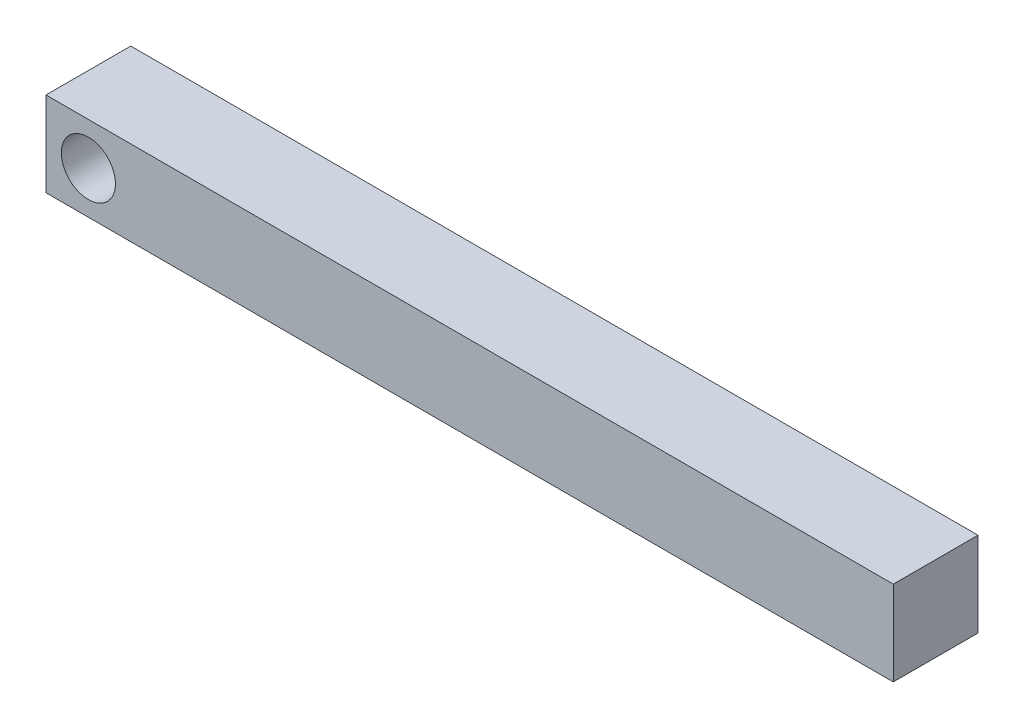
ISO-10303-21;
HEADER;
FILE_DESCRIPTION(('STEP AP214'),'2;1');
FILE_NAME('part.step','',(''),(''),'','','');
FILE_SCHEMA(('AUTOMOTIVE_DESIGN { 1 0 10303 214 1 1 1 1 }'));
ENDSEC;
DATA;
#1=APPLICATION_CONTEXT('core data for automotive mechanical design processes');
#2=APPLICATION_PROTOCOL_DEFINITION('international standard','automotive_design',2000,#1);
#3=PRODUCT_CONTEXT('',#1,'mechanical');
#4=PRODUCT('Part','Part','',(#3));
#5=PRODUCT_RELATED_PRODUCT_CATEGORY('part','',(#4));
#6=PRODUCT_DEFINITION_FORMATION('','',#4);
#7=PRODUCT_DEFINITION_CONTEXT('part definition',#1,'design');
#8=PRODUCT_DEFINITION('design','',#6,#7);
#9=PRODUCT_DEFINITION_SHAPE('','',#8);
#10=(LENGTH_UNIT() NAMED_UNIT(*) SI_UNIT(.MILLI.,.METRE.));
#11=(NAMED_UNIT(*) PLANE_ANGLE_UNIT() SI_UNIT($,.RADIAN.));
#12=(NAMED_UNIT(*) SI_UNIT($,.STERADIAN.) SOLID_ANGLE_UNIT());
#13=UNCERTAINTY_MEASURE_WITH_UNIT(LENGTH_MEASURE(1.E-05),#10,'distance_accuracy_value','');
#14=(GEOMETRIC_REPRESENTATION_CONTEXT(3) GLOBAL_UNCERTAINTY_ASSIGNED_CONTEXT((#13)) GLOBAL_UNIT_ASSIGNED_CONTEXT((#10,
#11,#12)) REPRESENTATION_CONTEXT('',''));
#15=CARTESIAN_POINT('',(0.,0.,0.));
#16=DIRECTION('',(0.,0.,1.));
#17=DIRECTION('',(1.,0.,0.));
#18=AXIS2_PLACEMENT_3D('',#15,#16,#17);
#19=CARTESIAN_POINT('',(-69.1020833333333,20.,-39.3263888888889));
#20=DIRECTION('',(1.,0.,0.));
#21=DIRECTION('',(0.,0.,-1.));
#22=AXIS2_PLACEMENT_3D('',#19,#20,#21);
#23=PLANE('',#22);
#24=DIRECTION('',(0.,0.,1.));
#25=VECTOR('',#24,1.);
#26=CARTESIAN_POINT('',(-69.1020833333333,0.,-39.3263888888889));
#27=LINE('',#26,#25);
#28=CARTESIAN_POINT('',(-69.1020833333333,0.,-39.3263888888889));
#29=VERTEX_POINT('',#28);
#30=CARTESIAN_POINT('',(-69.1020833333333,0.,-19.3263888888889));
#31=VERTEX_POINT('',#30);
#32=EDGE_CURVE('E71',#29,#31,#27,.T.);
#33=ORIENTED_EDGE('',*,*,#32,.T.);
#34=DIRECTION('',(0.,-1.,0.));
#35=VECTOR('',#34,1.);
#36=CARTESIAN_POINT('',(-69.1020833333333,20.,-19.3263888888889));
#37=LINE('',#36,#35);
#38=CARTESIAN_POINT('',(-69.1020833333333,20.,-19.3263888888889));
#39=VERTEX_POINT('',#38);
#40=EDGE_CURVE('E11',#39,#31,#37,.T.);
#41=ORIENTED_EDGE('',*,*,#40,.F.);
#42=DIRECTION('',(0.,0.,1.));
#43=VECTOR('',#42,1.);
#44=CARTESIAN_POINT('',(-69.1020833333333,20.,-39.3263888888889));
#45=LINE('',#44,#43);
#46=CARTESIAN_POINT('',(-69.1020833333333,20.,-39.3263888888889));
#47=VERTEX_POINT('',#46);
#48=EDGE_CURVE('E94',#47,#39,#45,.T.);
#49=ORIENTED_EDGE('',*,*,#48,.F.);
#50=DIRECTION('',(0.,-1.,0.));
#51=VECTOR('',#50,1.);
#52=CARTESIAN_POINT('',(-69.1020833333333,20.,-39.3263888888889));
#53=LINE('',#52,#51);
#54=EDGE_CURVE('E83',#47,#29,#53,.T.);
#55=ORIENTED_EDGE('',*,*,#54,.T.);
#56=EDGE_LOOP('',(#33,#41,#49,#55));
#57=FACE_BOUND('',#56,.T.);
#58=ADVANCED_FACE('F27',(#57),#23,.F.);
#59=CARTESIAN_POINT('',(-69.1020833333333,20.,-19.3263888888889));
#60=DIRECTION('',(0.,0.,-1.));
#61=DIRECTION('',(-1.,0.,0.));
#62=AXIS2_PLACEMENT_3D('',#59,#60,#61);
#63=PLANE('',#62);
#64=CARTESIAN_POINT('',(-59.1020833333333,10.,-19.3263888888889));
#65=DIRECTION('',(0.,0.,1.));
#66=DIRECTION('',(1.,0.,0.));
#67=AXIS2_PLACEMENT_3D('',#64,#65,#66);
#68=CIRCLE('',#67,6.38668888972468);
#69=CARTESIAN_POINT('',(-52.7153944436087,10.,-19.3263888888889));
#70=VERTEX_POINT('',#69);
#71=EDGE_CURVE('E87',#70,#70,#68,.T.);
#72=ORIENTED_EDGE('',*,*,#71,.F.);
#73=EDGE_LOOP('',(#72));
#74=FACE_BOUND('',#73,.T.);
#75=DIRECTION('',(1.,0.,0.));
#76=VECTOR('',#75,1.);
#77=CARTESIAN_POINT('',(-69.1020833333333,0.,-19.3263888888889));
#78=LINE('',#77,#76);
#79=CARTESIAN_POINT('',(130.897916666667,0.,-19.3263888888889));
#80=VERTEX_POINT('',#79);
#81=EDGE_CURVE('E67',#31,#80,#78,.T.);
#82=ORIENTED_EDGE('',*,*,#81,.T.);
#83=DIRECTION('',(0.,-1.,0.));
#84=VECTOR('',#83,1.);
#85=CARTESIAN_POINT('',(130.897916666667,20.,-19.3263888888889));
#86=LINE('',#85,#84);
#87=CARTESIAN_POINT('',(130.897916666667,20.,-19.3263888888889));
#88=VERTEX_POINT('',#87);
#89=EDGE_CURVE('E34',#88,#80,#86,.T.);
#90=ORIENTED_EDGE('',*,*,#89,.F.);
#91=DIRECTION('',(1.,0.,0.));
#92=VECTOR('',#91,1.);
#93=CARTESIAN_POINT('',(-69.1020833333333,20.,-19.3263888888889));
#94=LINE('',#93,#92);
#95=EDGE_CURVE('E79',#39,#88,#94,.T.);
#96=ORIENTED_EDGE('',*,*,#95,.F.);
#97=ORIENTED_EDGE('',*,*,#40,.T.);
#98=EDGE_LOOP('',(#82,#90,#96,#97));
#99=FACE_BOUND('',#98,.T.);
#100=ADVANCED_FACE('F78',(#74,#99),#63,.F.);
#101=CARTESIAN_POINT('',(130.897916666667,20.,-39.3263888888889));
#102=DIRECTION('',(-1.,0.,0.));
#103=DIRECTION('',(0.,0.,1.));
#104=AXIS2_PLACEMENT_3D('',#101,#102,#103);
#105=PLANE('',#104);
#106=DIRECTION('',(0.,0.,-1.));
#107=VECTOR('',#106,1.);
#108=CARTESIAN_POINT('',(130.897916666667,0.,-39.3263888888889));
#109=LINE('',#108,#107);
#110=CARTESIAN_POINT('',(130.897916666667,0.,-39.3263888888889));
#111=VERTEX_POINT('',#110);
#112=EDGE_CURVE('E72',#80,#111,#109,.T.);
#113=ORIENTED_EDGE('',*,*,#112,.T.);
#114=DIRECTION('',(0.,-1.,0.));
#115=VECTOR('',#114,1.);
#116=CARTESIAN_POINT('',(130.897916666667,20.,-39.3263888888889));
#117=LINE('',#116,#115);
#118=CARTESIAN_POINT('',(130.897916666667,20.,-39.3263888888889));
#119=VERTEX_POINT('',#118);
#120=EDGE_CURVE('E100',#119,#111,#117,.T.);
#121=ORIENTED_EDGE('',*,*,#120,.F.);
#122=DIRECTION('',(0.,0.,-1.));
#123=VECTOR('',#122,1.);
#124=CARTESIAN_POINT('',(130.897916666667,20.,-39.3263888888889));
#125=LINE('',#124,#123);
#126=EDGE_CURVE('E46',#88,#119,#125,.T.);
#127=ORIENTED_EDGE('',*,*,#126,.F.);
#128=ORIENTED_EDGE('',*,*,#89,.T.);
#129=EDGE_LOOP('',(#113,#121,#127,#128));
#130=FACE_BOUND('',#129,.T.);
#131=ADVANCED_FACE('F103',(#130),#105,.F.);
#132=CARTESIAN_POINT('',(-69.1020833333333,20.,-39.3263888888889));
#133=DIRECTION('',(0.,0.,1.));
#134=DIRECTION('',(1.,0.,0.));
#135=AXIS2_PLACEMENT_3D('',#132,#133,#134);
#136=PLANE('',#135);
#137=CARTESIAN_POINT('',(-59.1020833333333,10.,-39.3263888888889));
#138=DIRECTION('',(0.,0.,1.));
#139=DIRECTION('',(1.,0.,0.));
#140=AXIS2_PLACEMENT_3D('',#137,#138,#139);
#141=CIRCLE('',#140,6.38668888972468);
#142=CARTESIAN_POINT('',(-52.7153944436087,10.,-39.3263888888889));
#143=VERTEX_POINT('',#142);
#144=EDGE_CURVE('E84',#143,#143,#141,.T.);
#145=ORIENTED_EDGE('',*,*,#144,.T.);
#146=EDGE_LOOP('',(#145));
#147=FACE_BOUND('',#146,.T.);
#148=DIRECTION('',(-1.,0.,0.));
#149=VECTOR('',#148,1.);
#150=CARTESIAN_POINT('',(-69.1020833333333,0.,-39.3263888888889));
#151=LINE('',#150,#149);
#152=EDGE_CURVE('E92',#111,#29,#151,.T.);
#153=ORIENTED_EDGE('',*,*,#152,.T.);
#154=ORIENTED_EDGE('',*,*,#54,.F.);
#155=DIRECTION('',(-1.,0.,0.));
#156=VECTOR('',#155,1.);
#157=CARTESIAN_POINT('',(-69.1020833333333,20.,-39.3263888888889));
#158=LINE('',#157,#156);
#159=EDGE_CURVE('E41',#119,#47,#158,.T.);
#160=ORIENTED_EDGE('',*,*,#159,.F.);
#161=ORIENTED_EDGE('',*,*,#120,.T.);
#162=EDGE_LOOP('',(#153,#154,#160,#161));
#163=FACE_BOUND('',#162,.T.);
#164=ADVANCED_FACE('F105',(#147,#163),#136,.F.);
#165=CARTESIAN_POINT('',(-69.1020833333333,20.,-19.3263888888889));
#166=DIRECTION('',(0.,1.,0.));
#167=DIRECTION('',(0.,0.,1.));
#168=AXIS2_PLACEMENT_3D('',#165,#166,#167);
#169=PLANE('',#168);
#170=ORIENTED_EDGE('',*,*,#48,.T.);
#171=ORIENTED_EDGE('',*,*,#95,.T.);
#172=ORIENTED_EDGE('',*,*,#126,.T.);
#173=ORIENTED_EDGE('',*,*,#159,.T.);
#174=EDGE_LOOP('',(#170,#171,#172,#173));
#175=FACE_BOUND('',#174,.T.);
#176=ADVANCED_FACE('F106',(#175),#169,.T.);
#177=CARTESIAN_POINT('',(-69.1020833333333,0.,-19.3263888888889));
#178=DIRECTION('',(0.,1.,0.));
#179=DIRECTION('',(0.,0.,1.));
#180=AXIS2_PLACEMENT_3D('',#177,#178,#179);
#181=PLANE('',#180);
#182=ORIENTED_EDGE('',*,*,#32,.F.);
#183=ORIENTED_EDGE('',*,*,#152,.F.);
#184=ORIENTED_EDGE('',*,*,#112,.F.);
#185=ORIENTED_EDGE('',*,*,#81,.F.);
#186=EDGE_LOOP('',(#182,#183,#184,#185));
#187=FACE_BOUND('',#186,.T.);
#188=ADVANCED_FACE('F68',(#187),#181,.F.);
#189=CARTESIAN_POINT('',(-59.1020833333333,10.,-39.3263888888889));
#190=DIRECTION('',(0.,0.,1.));
#191=DIRECTION('',(1.,0.,0.));
#192=AXIS2_PLACEMENT_3D('',#189,#190,#191);
#193=CYLINDRICAL_SURFACE('',#192,6.38668888972468);
#194=ORIENTED_EDGE('',*,*,#144,.F.);
#195=EDGE_LOOP('',(#194));
#196=FACE_BOUND('',#195,.T.);
#197=ORIENTED_EDGE('',*,*,#71,.T.);
#198=EDGE_LOOP('',(#197));
#199=FACE_BOUND('',#198,.T.);
#200=ADVANCED_FACE('F113',(#196,#199),#193,.F.);
#201=CLOSED_SHELL('',(#58,#100,#131,#164,#176,#188,#200));
#202=MANIFOLD_SOLID_BREP('B2',#201);
#203=ADVANCED_BREP_SHAPE_REPRESENTATION('',(#18,#202),#14);
#204=SHAPE_DEFINITION_REPRESENTATION(#9,#203);
ENDSEC;
END-ISO-10303-21;
